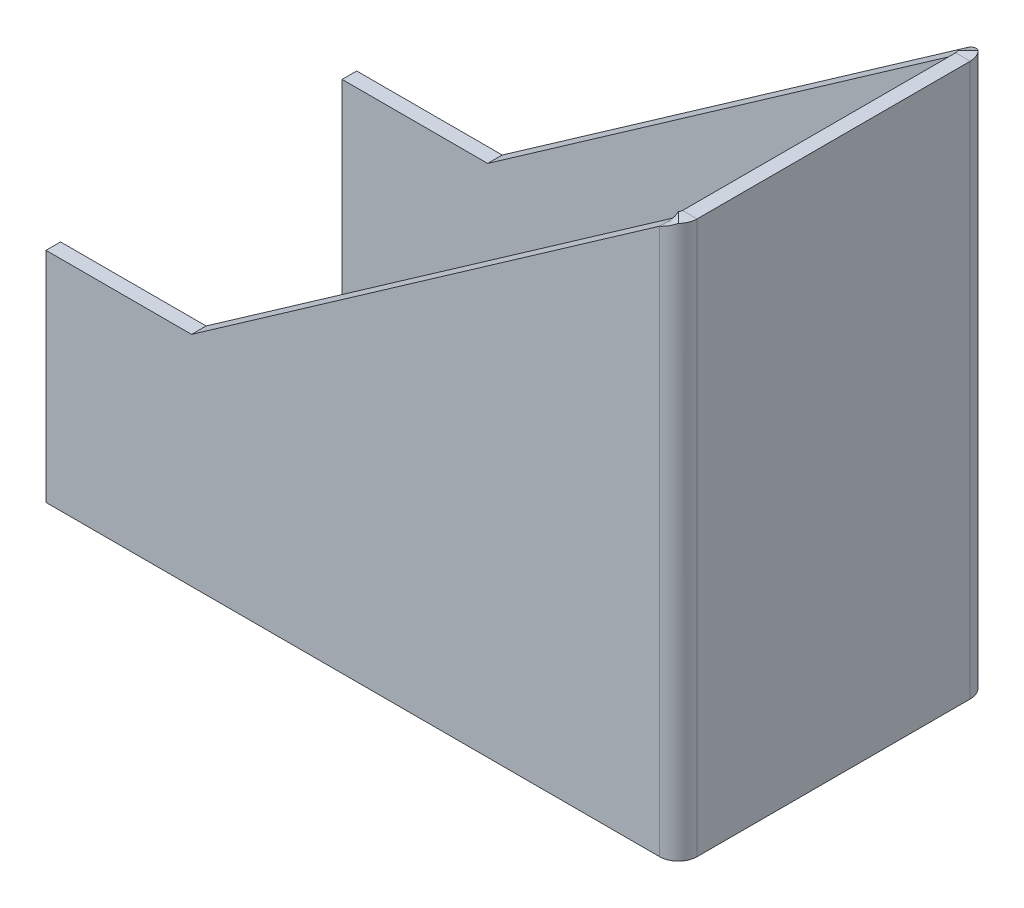
ISO-10303-21;
HEADER;
FILE_DESCRIPTION(('STEP AP214'),'2;1');
FILE_NAME('part.step','',(''),(''),'','','');
FILE_SCHEMA(('AUTOMOTIVE_DESIGN { 1 0 10303 214 1 1 1 1 }'));
ENDSEC;
DATA;
#1=APPLICATION_CONTEXT('core data for automotive mechanical design processes');
#2=APPLICATION_PROTOCOL_DEFINITION('international standard','automotive_design',2000,#1);
#3=PRODUCT_CONTEXT('',#1,'mechanical');
#4=PRODUCT('Part','Part','',(#3));
#5=PRODUCT_RELATED_PRODUCT_CATEGORY('part','',(#4));
#6=PRODUCT_DEFINITION_FORMATION('','',#4);
#7=PRODUCT_DEFINITION_CONTEXT('part definition',#1,'design');
#8=PRODUCT_DEFINITION('design','',#6,#7);
#9=PRODUCT_DEFINITION_SHAPE('','',#8);
#10=(LENGTH_UNIT() NAMED_UNIT(*) SI_UNIT(.MILLI.,.METRE.));
#11=(NAMED_UNIT(*) PLANE_ANGLE_UNIT() SI_UNIT($,.RADIAN.));
#12=(NAMED_UNIT(*) SI_UNIT($,.STERADIAN.) SOLID_ANGLE_UNIT());
#13=UNCERTAINTY_MEASURE_WITH_UNIT(LENGTH_MEASURE(1.E-05),#10,'distance_accuracy_value','');
#14=(GEOMETRIC_REPRESENTATION_CONTEXT(3) GLOBAL_UNCERTAINTY_ASSIGNED_CONTEXT((#13)) GLOBAL_UNIT_ASSIGNED_CONTEXT((#10,
#11,#12)) REPRESENTATION_CONTEXT('',''));
#15=CARTESIAN_POINT('',(0.,0.,0.));
#16=DIRECTION('',(0.,0.,1.));
#17=DIRECTION('',(1.,0.,0.));
#18=AXIS2_PLACEMENT_3D('',#15,#16,#17);
#19=CARTESIAN_POINT('',(-2.54,96.5569188096345,93.2309455038853));
#20=DIRECTION('',(0.,1.,0.));
#21=DIRECTION('',(0.,0.,1.));
#22=AXIS2_PLACEMENT_3D('',#19,#20,#21);
#23=PLANE('',#22);
#24=DIRECTION('',(0.,0.,1.));
#25=VECTOR('',#24,1.);
#26=CARTESIAN_POINT('',(-2.54,96.5569188096345,93.2309455038853));
#27=LINE('',#26,#25);
#28=CARTESIAN_POINT('',(-2.54,96.5569188096345,94.8069254585586));
#29=VERTEX_POINT('',#28);
#30=CARTESIAN_POINT('',(-2.54,96.5569188096344,142.454965549212));
#31=VERTEX_POINT('',#30);
#32=EDGE_CURVE('E537',#29,#31,#27,.T.);
#33=ORIENTED_EDGE('',*,*,#32,.T.);
#34=DIRECTION('',(1.,0.,0.));
#35=VECTOR('',#34,1.);
#36=CARTESIAN_POINT('',(-2.54,96.5569188096345,142.454965549212));
#37=LINE('',#36,#35);
#38=CARTESIAN_POINT('',(0.,96.5569188096345,142.454965549212));
#39=VERTEX_POINT('',#38);
#40=EDGE_CURVE('E12',#31,#39,#37,.T.);
#41=ORIENTED_EDGE('',*,*,#40,.T.);
#42=DIRECTION('',(0.,0.,1.));
#43=VECTOR('',#42,1.);
#44=CARTESIAN_POINT('',(0.,96.5569188096345,93.2309455038853));
#45=LINE('',#44,#43);
#46=CARTESIAN_POINT('',(0.,96.5569188096345,94.8069254585586));
#47=VERTEX_POINT('',#46);
#48=EDGE_CURVE('E547',#47,#39,#45,.T.);
#49=ORIENTED_EDGE('',*,*,#48,.F.);
#50=DIRECTION('',(1.,0.,0.));
#51=VECTOR('',#50,1.);
#52=CARTESIAN_POINT('',(-2.54,96.5569188096345,94.8069254585586));
#53=LINE('',#52,#51);
#54=EDGE_CURVE('E474',#29,#47,#53,.T.);
#55=ORIENTED_EDGE('',*,*,#54,.F.);
#56=EDGE_LOOP('',(#33,#41,#49,#55));
#57=FACE_BOUND('',#56,.T.);
#58=ADVANCED_FACE('F59',(#57),#23,.T.);
#59=CARTESIAN_POINT('',(-2.54,0.181552876368063,252.656793203646));
#60=DIRECTION('',(0.,-1.,0.));
#61=DIRECTION('',(0.,0.,-1.));
#62=AXIS2_PLACEMENT_3D('',#59,#60,#61);
#63=PLANE('',#62);
#64=DIRECTION('',(0.,0.,-1.));
#65=VECTOR('',#64,1.);
#66=CARTESIAN_POINT('',(0.,0.181552876368063,252.656793203646));
#67=LINE('',#66,#65);
#68=CARTESIAN_POINT('',(0.,0.181552876368091,142.454965549212));
#69=VERTEX_POINT('',#68);
#70=CARTESIAN_POINT('',(0.,0.181552876368063,94.8069254585586));
#71=VERTEX_POINT('',#70);
#72=EDGE_CURVE('E86',#69,#71,#67,.T.);
#73=ORIENTED_EDGE('',*,*,#72,.F.);
#74=DIRECTION('',(-1.,0.,0.));
#75=VECTOR('',#74,1.);
#76=CARTESIAN_POINT('',(-2.53999999999999,0.181552876368063,142.454965549212));
#77=LINE('',#76,#75);
#78=CARTESIAN_POINT('',(-2.54,0.181552876368091,142.454965549212));
#79=VERTEX_POINT('',#78);
#80=EDGE_CURVE('E542',#69,#79,#77,.T.);
#81=ORIENTED_EDGE('',*,*,#80,.T.);
#82=DIRECTION('',(0.,0.,-1.));
#83=VECTOR('',#82,1.);
#84=CARTESIAN_POINT('',(-2.54,0.181552876368063,252.656793203646));
#85=LINE('',#84,#83);
#86=CARTESIAN_POINT('',(-2.54,0.181552876368063,94.8069254585586));
#87=VERTEX_POINT('',#86);
#88=EDGE_CURVE('E475',#79,#87,#85,.T.);
#89=ORIENTED_EDGE('',*,*,#88,.T.);
#90=DIRECTION('',(-1.,0.,0.));
#91=VECTOR('',#90,1.);
#92=CARTESIAN_POINT('',(-2.53999999999999,0.181552876368063,94.8069254585587));
#93=LINE('',#92,#91);
#94=EDGE_CURVE('E481',#71,#87,#93,.T.);
#95=ORIENTED_EDGE('',*,*,#94,.F.);
#96=EDGE_LOOP('',(#73,#81,#89,#95));
#97=FACE_BOUND('',#96,.T.);
#98=ADVANCED_FACE('F522',(#97),#63,.T.);
#99=CARTESIAN_POINT('',(0.,0.,0.));
#100=DIRECTION('',(1.,0.,0.));
#101=DIRECTION('',(0.,0.,-1.));
#102=AXIS2_PLACEMENT_3D('',#99,#100,#101);
#103=PLANE('',#102);
#104=ORIENTED_EDGE('',*,*,#48,.T.);
#105=DIRECTION('',(0.,-1.,0.));
#106=VECTOR('',#105,1.);
#107=CARTESIAN_POINT('',(0.,0.,142.454965549212));
#108=LINE('',#107,#106);
#109=EDGE_CURVE('E70',#39,#69,#108,.T.);
#110=ORIENTED_EDGE('',*,*,#109,.T.);
#111=ORIENTED_EDGE('',*,*,#72,.T.);
#112=DIRECTION('',(0.,-1.,0.));
#113=VECTOR('',#112,1.);
#114=CARTESIAN_POINT('',(0.,0.,94.8069254585587));
#115=LINE('',#114,#113);
#116=EDGE_CURVE('E478',#47,#71,#115,.T.);
#117=ORIENTED_EDGE('',*,*,#116,.F.);
#118=EDGE_LOOP('',(#104,#110,#111,#117));
#119=FACE_BOUND('',#118,.T.);
#120=ADVANCED_FACE('F61',(#119),#103,.T.);
#121=CARTESIAN_POINT('',(-2.54,0.,0.));
#122=DIRECTION('',(1.,0.,0.));
#123=DIRECTION('',(0.,0.,-1.));
#124=AXIS2_PLACEMENT_3D('',#121,#122,#123);
#125=PLANE('',#124);
#126=DIRECTION('',(0.,-1.,0.));
#127=VECTOR('',#126,1.);
#128=CARTESIAN_POINT('',(-2.54,0.,142.454965549212));
#129=LINE('',#128,#127);
#130=EDGE_CURVE('E484',#31,#79,#129,.T.);
#131=ORIENTED_EDGE('',*,*,#130,.F.);
#132=ORIENTED_EDGE('',*,*,#32,.F.);
#133=DIRECTION('',(0.,-1.,0.));
#134=VECTOR('',#133,1.);
#135=CARTESIAN_POINT('',(-2.54,0.,94.8069254585587));
#136=LINE('',#135,#134);
#137=EDGE_CURVE('E467',#29,#87,#136,.T.);
#138=ORIENTED_EDGE('',*,*,#137,.T.);
#139=ORIENTED_EDGE('',*,*,#88,.F.);
#140=EDGE_LOOP('',(#131,#132,#138,#139));
#141=FACE_BOUND('',#140,.T.);
#142=ADVANCED_FACE('F428',(#141),#125,.F.);
#143=CARTESIAN_POINT('',(-0.959693920764166,96.5569188096345,92.4900193793228));
#144=CARTESIAN_POINT('',(-1.26302240536686,96.3729719591996,92.1866908947201));
#145=CARTESIAN_POINT('',(-1.62644204891672,96.1890811281912,91.943876978477));
#146=CARTESIAN_POINT('',(-2.41895688210839,95.821243446748,91.6156065861872));
#147=CARTESIAN_POINT('',(-2.84762874322076,95.6373526157396,91.5303254585586));
#148=CARTESIAN_POINT('',(-3.2766,95.4534057653048,91.5303254585586));
#149=CARTESIAN_POINT('',(-2.75574514497799,96.5569188096345,94.2860706035366));
#150=CARTESIAN_POINT('',(-2.82392753624599,96.3729928198986,94.2178882122686));
#151=CARTESIAN_POINT('',(-2.9056342590588,96.1890811281912,94.1632944048969));
#152=CARTESIAN_POINT('',(-3.08379650838096,95.821243446748,94.0894971849247));
#153=CARTESIAN_POINT('',(-3.18017553755376,95.6373317550407,94.0703254585586));
#154=CARTESIAN_POINT('',(-3.2766,95.4534057653048,94.0703254585586));
#155=B_SPLINE_SURFACE_WITH_KNOTS('',1,3,((#143,#144,#145,#146,#147,#148),(#149,#150,#151,#152,
#153,#154)),.UNSPECIFIED.,.F.,.F.,.F.,(2,2),(4,2,4),(0.,1.),(0.,0.5,1.),.UNSPECIFIED.);
#156=CARTESIAN_POINT('',(-2.75574514497799,96.5569188096345,94.2860706035366));
#157=CARTESIAN_POINT('',(-0.959693920764166,96.5569188096345,92.4900193793228));
#158=B_SPLINE_CURVE_WITH_KNOTS('',1,(#156,#157),.UNSPECIFIED.,.F.,.F.,(2,2),(0.,1.),.UNSPECIFIED.);
#159=CARTESIAN_POINT('',(-0.959693920764167,96.5569188096345,92.4900193793228));
#160=VERTEX_POINT('',#159);
#161=CARTESIAN_POINT('',(-2.75574514497799,96.5569188096345,94.2860706035366));
#162=VERTEX_POINT('',#161);
#163=EDGE_CURVE('E455',#160,#162,#158,.F.);
#164=CARTESIAN_POINT('',(-0.959693920764166,96.5569188096345,92.4900193793228));
#165=CARTESIAN_POINT('',(-1.26302240536686,96.3729719591996,92.1866908947201));
#166=CARTESIAN_POINT('',(-1.62644204891672,96.1890811281912,91.943876978477));
#167=CARTESIAN_POINT('',(-2.41895688210839,95.821243446748,91.6156065861872));
#168=CARTESIAN_POINT('',(-2.84762874322076,95.6373526157396,91.5303254585586));
#169=CARTESIAN_POINT('',(-3.2766,95.4534057653048,91.5303254585586));
#170=B_SPLINE_CURVE_WITH_KNOTS('',3,(#164,#165,#166,#167,#168,#169),.UNSPECIFIED.,.F.,.F.,(4,2,
4),(0.,0.5,1.),.UNSPECIFIED.);
#171=CARTESIAN_POINT('',(-3.2766,95.4534057653048,91.5303254585586));
#172=VERTEX_POINT('',#171);
#173=EDGE_CURVE('E329',#160,#172,#170,.T.);
#174=CARTESIAN_POINT('',(-3.2766,95.4534057653048,91.5303254585586));
#175=CARTESIAN_POINT('',(-3.2766,95.4534057653048,94.0703254585586));
#176=B_SPLINE_CURVE_WITH_KNOTS('',1,(#174,#175),.UNSPECIFIED.,.F.,.F.,(2,2),(0.,1.),.UNSPECIFIED.);
#177=CARTESIAN_POINT('',(-3.27659999999999,95.4534057653048,94.0703254585586));
#178=VERTEX_POINT('',#177);
#179=EDGE_CURVE('E491',#178,#172,#176,.F.);
#180=CARTESIAN_POINT('',(-3.2766,95.4534057653048,94.0703254585586));
#181=CARTESIAN_POINT('',(-3.18017553755376,95.6373317550407,94.0703254585586));
#182=CARTESIAN_POINT('',(-3.08379650838096,95.821243446748,94.0894971849247));
#183=CARTESIAN_POINT('',(-2.9056342590588,96.1890811281912,94.1632944048969));
#184=CARTESIAN_POINT('',(-2.82392753624599,96.3729928198986,94.2178882122686));
#185=CARTESIAN_POINT('',(-2.75574514497799,96.5569188096345,94.2860706035366));
#186=B_SPLINE_CURVE_WITH_KNOTS('',3,(#180,#181,#182,#183,#184,#185),.UNSPECIFIED.,.F.,.F.,(4,2,
4),(0.,0.5,1.),.UNSPECIFIED.);
#187=EDGE_CURVE('E359',#162,#178,#186,.F.);
#188=ORIENTED_EDGE('',*,*,#163,.F.);
#189=ORIENTED_EDGE('',*,*,#173,.T.);
#190=ORIENTED_EDGE('',*,*,#179,.F.);
#191=ORIENTED_EDGE('',*,*,#187,.F.);
#192=EDGE_LOOP('',(#188,#189,#190,#191));
#193=FACE_BOUND('',#192,.T.);
#194=ADVANCED_FACE('F417',(#193),#155,.F.);
#195=CARTESIAN_POINT('',(-3.2766,0.181552876368063,94.8069254585587));
#196=DIRECTION('',(0.,1.,0.));
#197=DIRECTION('',(0.,0.,1.));
#198=AXIS2_PLACEMENT_3D('',#195,#196,#197);
#199=PLANE('',#198);
#200=DIRECTION('',(0.,0.,1.));
#201=VECTOR('',#200,1.);
#202=CARTESIAN_POINT('',(-3.27659999999998,0.181552876368064,94.0703254585586));
#203=LINE('',#202,#201);
#204=CARTESIAN_POINT('',(-3.27659999999999,0.181552876368063,91.5303254585586));
#205=VERTEX_POINT('',#204);
#206=CARTESIAN_POINT('',(-3.2766,0.181552876368063,94.0703254585586));
#207=VERTEX_POINT('',#206);
#208=EDGE_CURVE('E332',#205,#207,#203,.T.);
#209=ORIENTED_EDGE('',*,*,#208,.F.);
#210=CARTESIAN_POINT('',(-3.2766,0.181552876368063,94.8069254585587));
#211=DIRECTION('',(0.,-1.,0.));
#212=DIRECTION('',(0.,0.,-1.));
#213=AXIS2_PLACEMENT_3D('',#210,#211,#212);
#214=CIRCLE('',#213,3.2766);
#215=EDGE_CURVE('E360',#205,#71,#214,.T.);
#216=ORIENTED_EDGE('',*,*,#215,.T.);
#217=ORIENTED_EDGE('',*,*,#94,.T.);
#218=CARTESIAN_POINT('',(-3.2766,0.181552876368063,94.8069254585587));
#219=DIRECTION('',(0.,-1.,0.));
#220=DIRECTION('',(0.,0.,1.));
#221=AXIS2_PLACEMENT_3D('',#218,#219,#220);
#222=CIRCLE('',#221,0.736600000000002);
#223=EDGE_CURVE('E355',#207,#87,#222,.T.);
#224=ORIENTED_EDGE('',*,*,#223,.F.);
#225=EDGE_LOOP('',(#209,#216,#217,#224));
#226=FACE_BOUND('',#225,.T.);
#227=ADVANCED_FACE('F389',(#226),#199,.F.);
#228=CARTESIAN_POINT('',(-3.2766,96.5569188096345,94.8069254585586));
#229=DIRECTION('',(0.,-1.,0.));
#230=DIRECTION('',(0.,0.,-1.));
#231=AXIS2_PLACEMENT_3D('',#228,#229,#230);
#232=PLANE('',#231);
#233=CARTESIAN_POINT('',(-3.2766,96.5569188096345,94.8069254585586));
#234=DIRECTION('',(0.,-1.,0.));
#235=DIRECTION('',(0.,0.,-1.));
#236=AXIS2_PLACEMENT_3D('',#233,#234,#235);
#237=CIRCLE('',#236,3.2766);
#238=EDGE_CURVE('E363',#47,#160,#237,.F.);
#239=ORIENTED_EDGE('',*,*,#238,.T.);
#240=ORIENTED_EDGE('',*,*,#163,.T.);
#241=CARTESIAN_POINT('',(-3.2766,96.5569188096345,94.8069254585586));
#242=DIRECTION('',(0.,1.,0.));
#243=DIRECTION('',(0.,0.,-1.));
#244=AXIS2_PLACEMENT_3D('',#241,#242,#243);
#245=CIRCLE('',#244,0.7366);
#246=EDGE_CURVE('E358',#29,#162,#245,.T.);
#247=ORIENTED_EDGE('',*,*,#246,.F.);
#248=ORIENTED_EDGE('',*,*,#54,.T.);
#249=EDGE_LOOP('',(#239,#240,#247,#248));
#250=FACE_BOUND('',#249,.T.);
#251=ADVANCED_FACE('F381',(#250),#232,.F.);
#252=CARTESIAN_POINT('',(-3.2766,144.829578005162,94.8069254585586));
#253=DIRECTION('',(0.,-1.,0.));
#254=DIRECTION('',(0.,0.,-1.));
#255=AXIS2_PLACEMENT_3D('',#252,#253,#254);
#256=CYLINDRICAL_SURFACE('',#255,0.7366);
#257=ORIENTED_EDGE('',*,*,#137,.F.);
#258=ORIENTED_EDGE('',*,*,#246,.T.);
#259=ORIENTED_EDGE('',*,*,#187,.T.);
#260=DIRECTION('',(0.,-1.,0.));
#261=VECTOR('',#260,1.);
#262=CARTESIAN_POINT('',(-3.27659999999998,0.,94.0703254585586));
#263=LINE('',#262,#261);
#264=EDGE_CURVE('E354',#178,#207,#263,.T.);
#265=ORIENTED_EDGE('',*,*,#264,.T.);
#266=ORIENTED_EDGE('',*,*,#223,.T.);
#267=EDGE_LOOP('',(#257,#258,#259,#265,#266));
#268=FACE_BOUND('',#267,.T.);
#269=ADVANCED_FACE('F370',(#268),#256,.F.);
#270=CARTESIAN_POINT('',(-3.2766,144.829578005162,94.8069254585586));
#271=DIRECTION('',(0.,-1.,0.));
#272=DIRECTION('',(0.,0.,-1.));
#273=AXIS2_PLACEMENT_3D('',#270,#271,#272);
#274=CYLINDRICAL_SURFACE('',#273,3.2766);
#275=ORIENTED_EDGE('',*,*,#116,.T.);
#276=ORIENTED_EDGE('',*,*,#215,.F.);
#277=DIRECTION('',(0.,-1.,0.));
#278=VECTOR('',#277,1.);
#279=CARTESIAN_POINT('',(-3.27659999999999,0.,91.5303254585586));
#280=LINE('',#279,#278);
#281=EDGE_CURVE('E342',#172,#205,#280,.T.);
#282=ORIENTED_EDGE('',*,*,#281,.F.);
#283=ORIENTED_EDGE('',*,*,#173,.F.);
#284=ORIENTED_EDGE('',*,*,#238,.F.);
#285=EDGE_LOOP('',(#275,#276,#282,#283,#284));
#286=FACE_BOUND('',#285,.T.);
#287=ADVANCED_FACE('F380',(#286),#274,.T.);
#288=CARTESIAN_POINT('',(-110.326467745088,0.181552876368094,94.070325458559));
#289=DIRECTION('',(-1.,0.,0.));
#290=DIRECTION('',(0.,1.,0.));
#291=AXIS2_PLACEMENT_3D('',#288,#289,#290);
#292=PLANE('',#291);
#293=DIRECTION('',(0.,1.,0.));
#294=VECTOR('',#293,1.);
#295=CARTESIAN_POINT('',(-110.326467745088,0.181552876368094,91.530325458559));
#296=LINE('',#295,#294);
#297=CARTESIAN_POINT('',(-110.326467745088,0.181552876368094,91.530325458559));
#298=VERTEX_POINT('',#297);
#299=CARTESIAN_POINT('',(-110.326467745088,38.2815528763681,91.530325458559));
#300=VERTEX_POINT('',#299);
#301=EDGE_CURVE('E337',#298,#300,#296,.T.);
#302=ORIENTED_EDGE('',*,*,#301,.F.);
#303=DIRECTION('',(0.,0.,-1.));
#304=VECTOR('',#303,1.);
#305=CARTESIAN_POINT('',(-110.326467745088,0.181552876368094,94.070325458559));
#306=LINE('',#305,#304);
#307=CARTESIAN_POINT('',(-110.326467745088,0.181552876368094,94.070325458559));
#308=VERTEX_POINT('',#307);
#309=EDGE_CURVE('E321',#308,#298,#306,.T.);
#310=ORIENTED_EDGE('',*,*,#309,.F.);
#311=DIRECTION('',(0.,1.,0.));
#312=VECTOR('',#311,1.);
#313=CARTESIAN_POINT('',(-110.326467745088,0.181552876368094,94.070325458559));
#314=LINE('',#313,#312);
#315=CARTESIAN_POINT('',(-110.326467745088,38.2815528763681,94.070325458559));
#316=VERTEX_POINT('',#315);
#317=EDGE_CURVE('E351',#308,#316,#314,.T.);
#318=ORIENTED_EDGE('',*,*,#317,.T.);
#319=DIRECTION('',(0.,0.,-1.));
#320=VECTOR('',#319,1.);
#321=CARTESIAN_POINT('',(-110.326467745088,38.2815528763681,94.070325458559));
#322=LINE('',#321,#320);
#323=EDGE_CURVE('E349',#316,#300,#322,.T.);
#324=ORIENTED_EDGE('',*,*,#323,.T.);
#325=EDGE_LOOP('',(#302,#310,#318,#324));
#326=FACE_BOUND('',#325,.T.);
#327=ADVANCED_FACE('F284',(#326),#292,.T.);
#328=CARTESIAN_POINT('',(-110.326467745088,38.2815528763681,94.070325458559));
#329=DIRECTION('',(0.,1.,0.));
#330=DIRECTION('',(1.,0.,0.));
#331=AXIS2_PLACEMENT_3D('',#328,#329,#330);
#332=PLANE('',#331);
#333=DIRECTION('',(1.,0.,0.));
#334=VECTOR('',#333,1.);
#335=CARTESIAN_POINT('',(-110.326467745088,38.2815528763681,91.530325458559));
#336=LINE('',#335,#334);
#337=CARTESIAN_POINT('',(-84.9264677450882,38.2815528763681,91.5303254585589));
#338=VERTEX_POINT('',#337);
#339=EDGE_CURVE('E334',#300,#338,#336,.T.);
#340=ORIENTED_EDGE('',*,*,#339,.F.);
#341=ORIENTED_EDGE('',*,*,#323,.F.);
#342=DIRECTION('',(1.,0.,0.));
#343=VECTOR('',#342,1.);
#344=CARTESIAN_POINT('',(-110.326467745088,38.2815528763681,94.070325458559));
#345=LINE('',#344,#343);
#346=CARTESIAN_POINT('',(-84.9264677450882,38.2815528763681,94.0703254585589));
#347=VERTEX_POINT('',#346);
#348=EDGE_CURVE('E346',#316,#347,#345,.T.);
#349=ORIENTED_EDGE('',*,*,#348,.T.);
#350=DIRECTION('',(0.,0.,-1.));
#351=VECTOR('',#350,1.);
#352=CARTESIAN_POINT('',(-84.9264677450882,38.2815528763681,94.0703254585589));
#353=LINE('',#352,#351);
#354=EDGE_CURVE('E343',#347,#338,#353,.T.);
#355=ORIENTED_EDGE('',*,*,#354,.T.);
#356=EDGE_LOOP('',(#340,#341,#349,#355));
#357=FACE_BOUND('',#356,.T.);
#358=ADVANCED_FACE('F698',(#357),#332,.T.);
#359=CARTESIAN_POINT('',(-94.931565549212,0.,94.070325458559));
#360=DIRECTION('',(0.,0.,-1.));
#361=DIRECTION('',(-1.,0.,0.));
#362=AXIS2_PLACEMENT_3D('',#359,#360,#361);
#363=PLANE('',#362);
#364=ORIENTED_EDGE('',*,*,#264,.F.);
#365=DIRECTION('',(0.819152044288991,0.573576436351047,0.));
#366=VECTOR('',#365,1.);
#367=CARTESIAN_POINT('',(-84.9264677450882,38.2815528763681,94.0703254585589));
#368=LINE('',#367,#366);
#369=EDGE_CURVE('E345',#347,#178,#368,.T.);
#370=ORIENTED_EDGE('',*,*,#369,.F.);
#371=ORIENTED_EDGE('',*,*,#348,.F.);
#372=ORIENTED_EDGE('',*,*,#317,.F.);
#373=DIRECTION('',(-1.,0.,0.));
#374=VECTOR('',#373,1.);
#375=CARTESIAN_POINT('',(157.725227654434,0.181552876368017,94.0703254585581));
#376=LINE('',#375,#374);
#377=EDGE_CURVE('E330',#207,#308,#376,.T.);
#378=ORIENTED_EDGE('',*,*,#377,.F.);
#379=EDGE_LOOP('',(#364,#370,#371,#372,#378));
#380=FACE_BOUND('',#379,.T.);
#381=ADVANCED_FACE('F514',(#380),#363,.F.);
#382=CARTESIAN_POINT('',(-84.9264677450882,38.2815528763681,94.0703254585589));
#383=DIRECTION('',(-0.573576436351047,0.819152044288991,0.));
#384=DIRECTION('',(0.819152044288992,0.573576436351047,0.));
#385=AXIS2_PLACEMENT_3D('',#382,#383,#384);
#386=PLANE('',#385);
#387=ORIENTED_EDGE('',*,*,#369,.T.);
#388=ORIENTED_EDGE('',*,*,#179,.T.);
#389=DIRECTION('',(0.819152044288991,0.573576436351047,0.));
#390=VECTOR('',#389,1.);
#391=CARTESIAN_POINT('',(-84.9264677450882,38.2815528763681,91.5303254585589));
#392=LINE('',#391,#390);
#393=EDGE_CURVE('E577',#338,#172,#392,.T.);
#394=ORIENTED_EDGE('',*,*,#393,.F.);
#395=ORIENTED_EDGE('',*,*,#354,.F.);
#396=EDGE_LOOP('',(#387,#388,#394,#395));
#397=FACE_BOUND('',#396,.T.);
#398=ADVANCED_FACE('F504',(#397),#386,.T.);
#399=CARTESIAN_POINT('',(-94.931565549212,0.,91.5303254585589));
#400=DIRECTION('',(0.,0.,-1.));
#401=DIRECTION('',(-1.,0.,0.));
#402=AXIS2_PLACEMENT_3D('',#399,#400,#401);
#403=PLANE('',#402);
#404=ORIENTED_EDGE('',*,*,#393,.T.);
#405=ORIENTED_EDGE('',*,*,#281,.T.);
#406=DIRECTION('',(-1.,0.,0.));
#407=VECTOR('',#406,1.);
#408=CARTESIAN_POINT('',(157.725227654434,0.181552876368017,91.5303254585581));
#409=LINE('',#408,#407);
#410=EDGE_CURVE('E340',#205,#298,#409,.T.);
#411=ORIENTED_EDGE('',*,*,#410,.T.);
#412=ORIENTED_EDGE('',*,*,#301,.T.);
#413=ORIENTED_EDGE('',*,*,#339,.T.);
#414=EDGE_LOOP('',(#404,#405,#411,#412,#413));
#415=FACE_BOUND('',#414,.T.);
#416=ADVANCED_FACE('F513',(#415),#403,.T.);
#417=CARTESIAN_POINT('',(157.725227654434,0.181552876368017,94.0703254585581));
#418=DIRECTION('',(0.,-1.,0.));
#419=DIRECTION('',(-1.,0.,0.));
#420=AXIS2_PLACEMENT_3D('',#417,#418,#419);
#421=PLANE('',#420);
#422=ORIENTED_EDGE('',*,*,#410,.F.);
#423=ORIENTED_EDGE('',*,*,#208,.T.);
#424=ORIENTED_EDGE('',*,*,#377,.T.);
#425=ORIENTED_EDGE('',*,*,#309,.T.);
#426=EDGE_LOOP('',(#422,#423,#424,#425));
#427=FACE_BOUND('',#426,.T.);
#428=ADVANCED_FACE('F383',(#427),#421,.T.);
#429=CARTESIAN_POINT('',(-3.2766,96.5569188096344,142.454965549212));
#430=DIRECTION('',(0.,-1.,0.));
#431=DIRECTION('',(0.,0.,-1.));
#432=AXIS2_PLACEMENT_3D('',#429,#430,#431);
#433=PLANE('',#432);
#434=CARTESIAN_POINT('',(-0.959693920764166,96.5569188096344,144.771871628447));
#435=CARTESIAN_POINT('',(-2.75574514497799,96.5569188096344,142.975820404234));
#436=B_SPLINE_CURVE_WITH_KNOTS('',1,(#434,#435),.UNSPECIFIED.,.F.,.F.,(2,2),(0.,1.),.UNSPECIFIED.);
#437=CARTESIAN_POINT('',(-0.959693920764166,96.5569188096344,144.771871628447));
#438=VERTEX_POINT('',#437);
#439=CARTESIAN_POINT('',(-2.75574514497799,96.5569188096344,142.975820404234));
#440=VERTEX_POINT('',#439);
#441=EDGE_CURVE('E309',#438,#440,#436,.T.);
#442=ORIENTED_EDGE('',*,*,#441,.F.);
#443=CARTESIAN_POINT('',(-3.2766,96.5569188096344,142.454965549212));
#444=DIRECTION('',(0.,1.,0.));
#445=DIRECTION('',(0.,0.,1.));
#446=AXIS2_PLACEMENT_3D('',#443,#444,#445);
#447=CIRCLE('',#446,3.2766);
#448=EDGE_CURVE('E78',#438,#39,#447,.T.);
#449=ORIENTED_EDGE('',*,*,#448,.T.);
#450=ORIENTED_EDGE('',*,*,#40,.F.);
#451=CARTESIAN_POINT('',(-3.2766,96.5569188096344,142.454965549212));
#452=DIRECTION('',(0.,1.,0.));
#453=DIRECTION('',(0.,0.,-1.));
#454=AXIS2_PLACEMENT_3D('',#451,#452,#453);
#455=CIRCLE('',#454,0.7366);
#456=EDGE_CURVE('E215',#440,#31,#455,.T.);
#457=ORIENTED_EDGE('',*,*,#456,.F.);
#458=EDGE_LOOP('',(#442,#449,#450,#457));
#459=FACE_BOUND('',#458,.T.);
#460=ADVANCED_FACE('F282',(#459),#433,.F.);
#461=CARTESIAN_POINT('',(-3.2766,0.181552876368063,142.454965549212));
#462=DIRECTION('',(0.,1.,0.));
#463=DIRECTION('',(0.,0.,1.));
#464=AXIS2_PLACEMENT_3D('',#461,#462,#463);
#465=PLANE('',#464);
#466=ORIENTED_EDGE('',*,*,#80,.F.);
#467=CARTESIAN_POINT('',(-3.2766,0.181552876368091,142.454965549212));
#468=DIRECTION('',(0.,1.,0.));
#469=DIRECTION('',(0.,0.,1.));
#470=AXIS2_PLACEMENT_3D('',#467,#468,#469);
#471=CIRCLE('',#470,3.2766);
#472=CARTESIAN_POINT('',(-3.27659999999999,0.181552876368063,145.731565549212));
#473=VERTEX_POINT('',#472);
#474=EDGE_CURVE('E216',#69,#473,#471,.F.);
#475=ORIENTED_EDGE('',*,*,#474,.T.);
#476=DIRECTION('',(0.,0.,-1.));
#477=VECTOR('',#476,1.);
#478=CARTESIAN_POINT('',(-3.27659999999999,0.181552876368063,143.191565549212));
#479=LINE('',#478,#477);
#480=CARTESIAN_POINT('',(-3.27659999999999,0.181552876368063,143.191565549212));
#481=VERTEX_POINT('',#480);
#482=EDGE_CURVE('E203',#473,#481,#479,.T.);
#483=ORIENTED_EDGE('',*,*,#482,.T.);
#484=CARTESIAN_POINT('',(-3.2766,0.181552876368063,142.454965549212));
#485=DIRECTION('',(0.,-1.,0.));
#486=DIRECTION('',(0.,0.,1.));
#487=AXIS2_PLACEMENT_3D('',#484,#485,#486);
#488=CIRCLE('',#487,0.736600000000002);
#489=EDGE_CURVE('E211',#79,#481,#488,.T.);
#490=ORIENTED_EDGE('',*,*,#489,.F.);
#491=EDGE_LOOP('',(#466,#475,#483,#490));
#492=FACE_BOUND('',#491,.T.);
#493=ADVANCED_FACE('F251',(#492),#465,.F.);
#494=CARTESIAN_POINT('',(-3.2766,95.4534057653048,145.731565549212));
#495=CARTESIAN_POINT('',(-2.84762874322073,95.6373526157397,145.731565549212));
#496=CARTESIAN_POINT('',(-2.41895688210839,95.821243446748,145.646284421583));
#497=CARTESIAN_POINT('',(-1.62644204891672,96.1890811281912,145.318014029293));
#498=CARTESIAN_POINT('',(-1.26302240536694,96.3729719591995,145.07520011305));
#499=CARTESIAN_POINT('',(-0.959693920764166,96.5569188096344,144.771871628447));
#500=CARTESIAN_POINT('',(-3.2766,95.4534057653048,143.191565549212));
#501=CARTESIAN_POINT('',(-3.18017553755377,95.6373317550407,143.191565549212));
#502=CARTESIAN_POINT('',(-3.08379650838096,95.821243446748,143.172393822845));
#503=CARTESIAN_POINT('',(-2.9056342590588,96.1890811281912,143.098596602873));
#504=CARTESIAN_POINT('',(-2.82392753624598,96.3729928198986,143.044002795502));
#505=CARTESIAN_POINT('',(-2.75574514497799,96.5569188096344,142.975820404234));
#506=B_SPLINE_SURFACE_WITH_KNOTS('',1,3,((#494,#495,#496,#497,#498,#499),(#500,#501,#502,#503,
#504,#505)),.UNSPECIFIED.,.F.,.F.,.F.,(2,2),(4,2,4),(0.,1.),(0.,0.5,1.),.UNSPECIFIED.);
#507=CARTESIAN_POINT('',(-3.2766,95.4534057653048,145.731565549212));
#508=CARTESIAN_POINT('',(-2.84762874322073,95.6373526157397,145.731565549212));
#509=CARTESIAN_POINT('',(-2.41895688210839,95.821243446748,145.646284421583));
#510=CARTESIAN_POINT('',(-1.62644204891672,96.1890811281912,145.318014029293));
#511=CARTESIAN_POINT('',(-1.26302240536694,96.3729719591995,145.07520011305));
#512=CARTESIAN_POINT('',(-0.959693920764166,96.5569188096344,144.771871628447));
#513=B_SPLINE_CURVE_WITH_KNOTS('',3,(#507,#508,#509,#510,#511,#512),.UNSPECIFIED.,.F.,.F.,(4,2,
4),(0.,0.5,1.),.UNSPECIFIED.);
#514=CARTESIAN_POINT('',(-3.27659999999999,95.4534057653048,145.731565549212));
#515=VERTEX_POINT('',#514);
#516=EDGE_CURVE('E219',#515,#438,#513,.T.);
#517=CARTESIAN_POINT('',(-2.75574514497799,96.5569188096344,142.975820404234));
#518=CARTESIAN_POINT('',(-2.82392753624598,96.3729928198986,143.044002795502));
#519=CARTESIAN_POINT('',(-2.9056342590588,96.1890811281912,143.098596602873));
#520=CARTESIAN_POINT('',(-3.08379650838096,95.821243446748,143.172393822845));
#521=CARTESIAN_POINT('',(-3.18017553755377,95.6373317550407,143.191565549212));
#522=CARTESIAN_POINT('',(-3.2766,95.4534057653048,143.191565549212));
#523=B_SPLINE_CURVE_WITH_KNOTS('',3,(#517,#518,#519,#520,#521,#522),.UNSPECIFIED.,.F.,.F.,(4,2,
4),(0.,0.5,1.),.UNSPECIFIED.);
#524=CARTESIAN_POINT('',(-3.2766,95.4534057653048,143.191565549212));
#525=VERTEX_POINT('',#524);
#526=EDGE_CURVE('E214',#525,#440,#523,.F.);
#527=CARTESIAN_POINT('',(-3.2766,95.4534057653048,143.191565549212));
#528=CARTESIAN_POINT('',(-3.2766,95.4534057653048,145.731565549212));
#529=B_SPLINE_CURVE_WITH_KNOTS('',1,(#527,#528),.UNSPECIFIED.,.F.,.F.,(2,2),(0.,1.),.UNSPECIFIED.);
#530=EDGE_CURVE('E184',#525,#515,#529,.T.);
#531=ORIENTED_EDGE('',*,*,#516,.T.);
#532=ORIENTED_EDGE('',*,*,#441,.T.);
#533=ORIENTED_EDGE('',*,*,#526,.F.);
#534=ORIENTED_EDGE('',*,*,#530,.T.);
#535=EDGE_LOOP('',(#531,#532,#533,#534));
#536=FACE_BOUND('',#535,.T.);
#537=ADVANCED_FACE('F243',(#536),#506,.F.);
#538=CARTESIAN_POINT('',(-3.2766,-48.0911063191595,142.454965549212));
#539=DIRECTION('',(0.,1.,0.));
#540=DIRECTION('',(0.,0.,1.));
#541=AXIS2_PLACEMENT_3D('',#538,#539,#540);
#542=CYLINDRICAL_SURFACE('',#541,0.7366);
#543=DIRECTION('',(0.,-1.,0.));
#544=VECTOR('',#543,1.);
#545=CARTESIAN_POINT('',(-3.27659999999999,0.,143.191565549212));
#546=LINE('',#545,#544);
#547=EDGE_CURVE('E555',#525,#481,#546,.T.);
#548=ORIENTED_EDGE('',*,*,#547,.F.);
#549=ORIENTED_EDGE('',*,*,#526,.T.);
#550=ORIENTED_EDGE('',*,*,#456,.T.);
#551=ORIENTED_EDGE('',*,*,#130,.T.);
#552=ORIENTED_EDGE('',*,*,#489,.T.);
#553=EDGE_LOOP('',(#548,#549,#550,#551,#552));
#554=FACE_BOUND('',#553,.T.);
#555=ADVANCED_FACE('F233',(#554),#542,.F.);
#556=CARTESIAN_POINT('',(-3.2766,-48.0911063191595,142.454965549212));
#557=DIRECTION('',(0.,1.,0.));
#558=DIRECTION('',(0.,0.,1.));
#559=AXIS2_PLACEMENT_3D('',#556,#557,#558);
#560=CYLINDRICAL_SURFACE('',#559,3.2766);
#561=DIRECTION('',(0.,-1.,0.));
#562=VECTOR('',#561,1.);
#563=CARTESIAN_POINT('',(-3.27659999999999,0.,145.731565549212));
#564=LINE('',#563,#562);
#565=EDGE_CURVE('E207',#515,#473,#564,.T.);
#566=ORIENTED_EDGE('',*,*,#565,.T.);
#567=ORIENTED_EDGE('',*,*,#474,.F.);
#568=ORIENTED_EDGE('',*,*,#109,.F.);
#569=ORIENTED_EDGE('',*,*,#448,.F.);
#570=ORIENTED_EDGE('',*,*,#516,.F.);
#571=EDGE_LOOP('',(#566,#567,#568,#569,#570));
#572=FACE_BOUND('',#571,.T.);
#573=ADVANCED_FACE('F242',(#572),#560,.T.);
#574=CARTESIAN_POINT('',(-84.9264677450882,38.2815528763681,143.191565549211));
#575=DIRECTION('',(0.,1.,0.));
#576=DIRECTION('',(-1.,0.,0.));
#577=AXIS2_PLACEMENT_3D('',#574,#575,#576);
#578=PLANE('',#577);
#579=DIRECTION('',(-1.,0.,0.));
#580=VECTOR('',#579,1.);
#581=CARTESIAN_POINT('',(-84.9264677450882,38.2815528763681,145.731565549211));
#582=LINE('',#581,#580);
#583=CARTESIAN_POINT('',(-84.9264677450882,38.2815528763681,145.731565549211));
#584=VERTEX_POINT('',#583);
#585=CARTESIAN_POINT('',(-110.326467745088,38.2815528763681,145.731565549211));
#586=VERTEX_POINT('',#585);
#587=EDGE_CURVE('E195',#584,#586,#582,.T.);
#588=ORIENTED_EDGE('',*,*,#587,.F.);
#589=DIRECTION('',(0.,0.,1.));
#590=VECTOR('',#589,1.);
#591=CARTESIAN_POINT('',(-84.9264677450882,38.2815528763681,143.191565549211));
#592=LINE('',#591,#590);
#593=CARTESIAN_POINT('',(-84.9264677450882,38.2815528763681,143.191565549211));
#594=VERTEX_POINT('',#593);
#595=EDGE_CURVE('E181',#594,#584,#592,.T.);
#596=ORIENTED_EDGE('',*,*,#595,.F.);
#597=DIRECTION('',(-1.,0.,0.));
#598=VECTOR('',#597,1.);
#599=CARTESIAN_POINT('',(-84.9264677450882,38.2815528763681,143.191565549211));
#600=LINE('',#599,#598);
#601=CARTESIAN_POINT('',(-110.326467745088,38.2815528763681,143.191565549211));
#602=VERTEX_POINT('',#601);
#603=EDGE_CURVE('E193',#594,#602,#600,.T.);
#604=ORIENTED_EDGE('',*,*,#603,.T.);
#605=DIRECTION('',(0.,0.,1.));
#606=VECTOR('',#605,1.);
#607=CARTESIAN_POINT('',(-110.326467745088,38.2815528763681,143.191565549211));
#608=LINE('',#607,#606);
#609=EDGE_CURVE('E202',#602,#586,#608,.T.);
#610=ORIENTED_EDGE('',*,*,#609,.T.);
#611=EDGE_LOOP('',(#588,#596,#604,#610));
#612=FACE_BOUND('',#611,.T.);
#613=ADVANCED_FACE('F192',(#612),#578,.T.);
#614=CARTESIAN_POINT('',(-110.326467745088,38.2815528763681,143.191565549211));
#615=DIRECTION('',(-1.,0.,0.));
#616=DIRECTION('',(0.,0.,1.));
#617=AXIS2_PLACEMENT_3D('',#614,#615,#616);
#618=PLANE('',#617);
#619=DIRECTION('',(0.,-1.,0.));
#620=VECTOR('',#619,1.);
#621=CARTESIAN_POINT('',(-110.326467745088,38.2815528763681,145.731565549211));
#622=LINE('',#621,#620);
#623=CARTESIAN_POINT('',(-110.326467745088,0.181552876368063,145.731565549211));
#624=VERTEX_POINT('',#623);
#625=EDGE_CURVE('E603',#586,#624,#622,.T.);
#626=ORIENTED_EDGE('',*,*,#625,.F.);
#627=ORIENTED_EDGE('',*,*,#609,.F.);
#628=DIRECTION('',(0.,-1.,0.));
#629=VECTOR('',#628,1.);
#630=CARTESIAN_POINT('',(-110.326467745088,38.2815528763681,143.191565549211));
#631=LINE('',#630,#629);
#632=CARTESIAN_POINT('',(-110.326467745088,0.181552876368063,143.191565549211));
#633=VERTEX_POINT('',#632);
#634=EDGE_CURVE('E201',#602,#633,#631,.T.);
#635=ORIENTED_EDGE('',*,*,#634,.T.);
#636=DIRECTION('',(0.,0.,1.));
#637=VECTOR('',#636,1.);
#638=CARTESIAN_POINT('',(-110.326467745088,0.181552876368063,143.191565549211));
#639=LINE('',#638,#637);
#640=EDGE_CURVE('E558',#633,#624,#639,.T.);
#641=ORIENTED_EDGE('',*,*,#640,.T.);
#642=EDGE_LOOP('',(#626,#627,#635,#641));
#643=FACE_BOUND('',#642,.T.);
#644=ADVANCED_FACE('F601',(#643),#618,.T.);
#645=CARTESIAN_POINT('',(142.330325458558,0.,143.191565549212));
#646=DIRECTION('',(0.,0.,1.));
#647=DIRECTION('',(1.,0.,0.));
#648=AXIS2_PLACEMENT_3D('',#645,#646,#647);
#649=PLANE('',#648);
#650=DIRECTION('',(-0.819152044288991,-0.573576436351047,0.));
#651=VECTOR('',#650,1.);
#652=CARTESIAN_POINT('',(-1.70062004532667,96.5569188096345,143.191565549212));
#653=LINE('',#652,#651);
#654=EDGE_CURVE('E178',#525,#594,#653,.T.);
#655=ORIENTED_EDGE('',*,*,#654,.F.);
#656=ORIENTED_EDGE('',*,*,#547,.T.);
#657=DIRECTION('',(1.,0.,0.));
#658=VECTOR('',#657,1.);
#659=CARTESIAN_POINT('',(-110.326467745088,0.181552876368063,143.191565549211));
#660=LINE('',#659,#658);
#661=EDGE_CURVE('E557',#633,#481,#660,.T.);
#662=ORIENTED_EDGE('',*,*,#661,.F.);
#663=ORIENTED_EDGE('',*,*,#634,.F.);
#664=ORIENTED_EDGE('',*,*,#603,.F.);
#665=EDGE_LOOP('',(#655,#656,#662,#663,#664));
#666=FACE_BOUND('',#665,.T.);
#667=ADVANCED_FACE('F198',(#666),#649,.F.);
#668=CARTESIAN_POINT('',(-110.326467745088,0.181552876368063,143.191565549211));
#669=DIRECTION('',(0.,-1.,0.));
#670=DIRECTION('',(1.,0.,0.));
#671=AXIS2_PLACEMENT_3D('',#668,#669,#670);
#672=PLANE('',#671);
#673=ORIENTED_EDGE('',*,*,#482,.F.);
#674=DIRECTION('',(1.,0.,0.));
#675=VECTOR('',#674,1.);
#676=CARTESIAN_POINT('',(-110.326467745088,0.181552876368063,145.731565549211));
#677=LINE('',#676,#675);
#678=EDGE_CURVE('E188',#624,#473,#677,.T.);
#679=ORIENTED_EDGE('',*,*,#678,.F.);
#680=ORIENTED_EDGE('',*,*,#640,.F.);
#681=ORIENTED_EDGE('',*,*,#661,.T.);
#682=EDGE_LOOP('',(#673,#679,#680,#681));
#683=FACE_BOUND('',#682,.T.);
#684=ADVANCED_FACE('F593',(#683),#672,.T.);
#685=CARTESIAN_POINT('',(142.330325458558,0.,145.731565549212));
#686=DIRECTION('',(0.,0.,1.));
#687=DIRECTION('',(1.,0.,0.));
#688=AXIS2_PLACEMENT_3D('',#685,#686,#687);
#689=PLANE('',#688);
#690=ORIENTED_EDGE('',*,*,#565,.F.);
#691=DIRECTION('',(-0.819152044288991,-0.573576436351047,0.));
#692=VECTOR('',#691,1.);
#693=CARTESIAN_POINT('',(-1.70062004532667,96.5569188096345,145.731565549212));
#694=LINE('',#693,#692);
#695=EDGE_CURVE('E561',#515,#584,#694,.T.);
#696=ORIENTED_EDGE('',*,*,#695,.T.);
#697=ORIENTED_EDGE('',*,*,#587,.T.);
#698=ORIENTED_EDGE('',*,*,#625,.T.);
#699=ORIENTED_EDGE('',*,*,#678,.T.);
#700=EDGE_LOOP('',(#690,#696,#697,#698,#699));
#701=FACE_BOUND('',#700,.T.);
#702=ADVANCED_FACE('F604',(#701),#689,.T.);
#703=CARTESIAN_POINT('',(-1.70062004532667,96.5569188096345,143.191565549212));
#704=DIRECTION('',(-0.573576436351047,0.819152044288991,0.));
#705=DIRECTION('',(-0.819152044288991,-0.573576436351047,0.));
#706=AXIS2_PLACEMENT_3D('',#703,#704,#705);
#707=PLANE('',#706);
#708=ORIENTED_EDGE('',*,*,#530,.F.);
#709=ORIENTED_EDGE('',*,*,#654,.T.);
#710=ORIENTED_EDGE('',*,*,#595,.T.);
#711=ORIENTED_EDGE('',*,*,#695,.F.);
#712=EDGE_LOOP('',(#708,#709,#710,#711));
#713=FACE_BOUND('',#712,.T.);
#714=ADVANCED_FACE('F180',(#713),#707,.T.);
#715=CLOSED_SHELL('',(#58,#98,#120,#142,#194,#227,#251,#269,#287,#327,#358,#381,#398,#416,#428,
#460,#493,#537,#555,#573,#613,#644,#667,#684,#702,#714));
#716=MANIFOLD_SOLID_BREP('B2',#715);
#717=ADVANCED_BREP_SHAPE_REPRESENTATION('',(#18,#716),#14);
#718=SHAPE_DEFINITION_REPRESENTATION(#9,#717);
ENDSEC;
END-ISO-10303-21;
